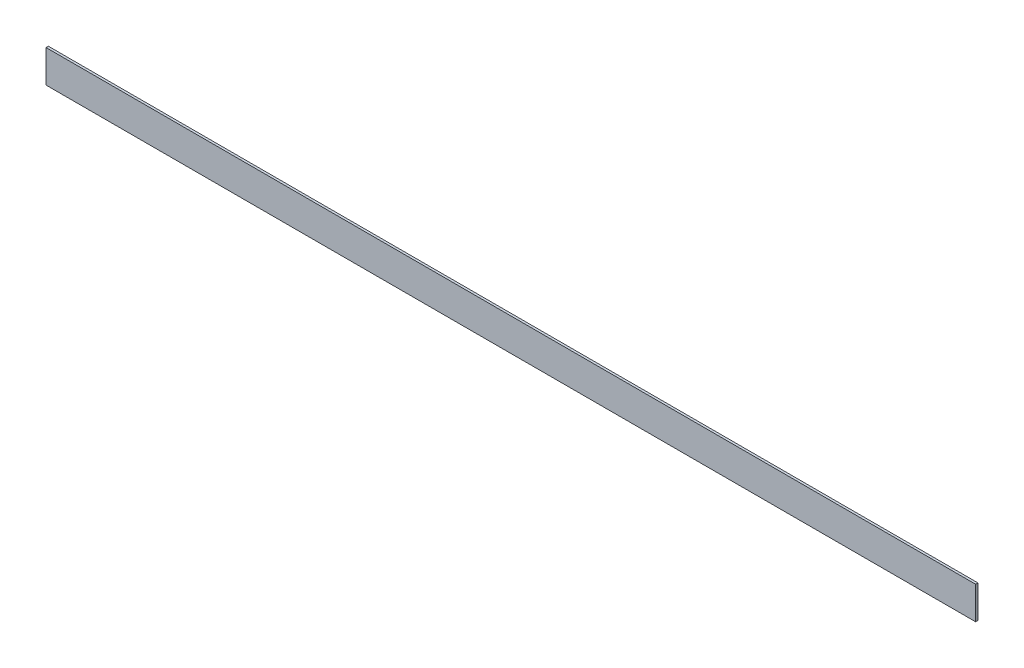
ISO-10303-21;
HEADER;
FILE_DESCRIPTION(('STEP AP214'),'2;1');
FILE_NAME('part.step','',(''),(''),'','','');
FILE_SCHEMA(('AUTOMOTIVE_DESIGN { 1 0 10303 214 1 1 1 1 }'));
ENDSEC;
DATA;
#1=APPLICATION_CONTEXT('core data for automotive mechanical design processes');
#2=APPLICATION_PROTOCOL_DEFINITION('international standard','automotive_design',2000,#1);
#3=PRODUCT_CONTEXT('',#1,'mechanical');
#4=PRODUCT('Part','Part','',(#3));
#5=PRODUCT_RELATED_PRODUCT_CATEGORY('part','',(#4));
#6=PRODUCT_DEFINITION_FORMATION('','',#4);
#7=PRODUCT_DEFINITION_CONTEXT('part definition',#1,'design');
#8=PRODUCT_DEFINITION('design','',#6,#7);
#9=PRODUCT_DEFINITION_SHAPE('','',#8);
#10=(LENGTH_UNIT() NAMED_UNIT(*) SI_UNIT(.MILLI.,.METRE.));
#11=(NAMED_UNIT(*) PLANE_ANGLE_UNIT() SI_UNIT($,.RADIAN.));
#12=(NAMED_UNIT(*) SI_UNIT($,.STERADIAN.) SOLID_ANGLE_UNIT());
#13=UNCERTAINTY_MEASURE_WITH_UNIT(LENGTH_MEASURE(1.E-05),#10,'distance_accuracy_value','');
#14=(GEOMETRIC_REPRESENTATION_CONTEXT(3) GLOBAL_UNCERTAINTY_ASSIGNED_CONTEXT((#13)) GLOBAL_UNIT_ASSIGNED_CONTEXT((#10,
#11,#12)) REPRESENTATION_CONTEXT('',''));
#15=CARTESIAN_POINT('',(0.,0.,0.));
#16=DIRECTION('',(0.,0.,1.));
#17=DIRECTION('',(1.,0.,0.));
#18=AXIS2_PLACEMENT_3D('',#15,#16,#17);
#19=CARTESIAN_POINT('',(-1000.,-35.0000000000001,5.));
#20=DIRECTION('',(1.,0.,0.));
#21=DIRECTION('',(0.,0.,-1.));
#22=AXIS2_PLACEMENT_3D('',#19,#20,#21);
#23=PLANE('',#22);
#24=DIRECTION('',(0.,-1.,0.));
#25=VECTOR('',#24,1.);
#26=CARTESIAN_POINT('',(-1000.,-35.0000000000001,0.));
#27=LINE('',#26,#25);
#28=CARTESIAN_POINT('',(-1000.,34.9999999999999,0.));
#29=VERTEX_POINT('',#28);
#30=CARTESIAN_POINT('',(-1000.,-35.0000000000001,0.));
#31=VERTEX_POINT('',#30);
#32=EDGE_CURVE('E107',#29,#31,#27,.T.);
#33=ORIENTED_EDGE('',*,*,#32,.T.);
#34=DIRECTION('',(0.,0.,-1.));
#35=VECTOR('',#34,1.);
#36=CARTESIAN_POINT('',(-1000.,-35.0000000000001,5.));
#37=LINE('',#36,#35);
#38=CARTESIAN_POINT('',(-1000.,-35.0000000000001,5.));
#39=VERTEX_POINT('',#38);
#40=EDGE_CURVE('E11',#39,#31,#37,.T.);
#41=ORIENTED_EDGE('',*,*,#40,.F.);
#42=DIRECTION('',(0.,-1.,0.));
#43=VECTOR('',#42,1.);
#44=CARTESIAN_POINT('',(-1000.,-35.0000000000001,5.));
#45=LINE('',#44,#43);
#46=CARTESIAN_POINT('',(-1000.,34.9999999999999,5.));
#47=VERTEX_POINT('',#46);
#48=EDGE_CURVE('E91',#47,#39,#45,.T.);
#49=ORIENTED_EDGE('',*,*,#48,.F.);
#50=DIRECTION('',(0.,0.,-1.));
#51=VECTOR('',#50,1.);
#52=CARTESIAN_POINT('',(-1000.,34.9999999999999,5.));
#53=LINE('',#52,#51);
#54=EDGE_CURVE('E103',#47,#29,#53,.T.);
#55=ORIENTED_EDGE('',*,*,#54,.T.);
#56=EDGE_LOOP('',(#33,#41,#49,#55));
#57=FACE_BOUND('',#56,.T.);
#58=ADVANCED_FACE('F39',(#57),#23,.F.);
#59=CARTESIAN_POINT('',(1000.,-34.9999999999999,5.));
#60=DIRECTION('',(0.,1.,0.));
#61=DIRECTION('',(-1.,0.,0.));
#62=AXIS2_PLACEMENT_3D('',#59,#60,#61);
#63=PLANE('',#62);
#64=DIRECTION('',(1.,0.,0.));
#65=VECTOR('',#64,1.);
#66=CARTESIAN_POINT('',(1000.,-34.9999999999999,0.));
#67=LINE('',#66,#65);
#68=CARTESIAN_POINT('',(1000.,-34.9999999999999,0.));
#69=VERTEX_POINT('',#68);
#70=EDGE_CURVE('E96',#31,#69,#67,.T.);
#71=ORIENTED_EDGE('',*,*,#70,.T.);
#72=DIRECTION('',(0.,0.,-1.));
#73=VECTOR('',#72,1.);
#74=CARTESIAN_POINT('',(1000.,-34.9999999999999,5.));
#75=LINE('',#74,#73);
#76=CARTESIAN_POINT('',(1000.,-34.9999999999999,5.));
#77=VERTEX_POINT('',#76);
#78=EDGE_CURVE('E48',#77,#69,#75,.T.);
#79=ORIENTED_EDGE('',*,*,#78,.F.);
#80=DIRECTION('',(1.,0.,0.));
#81=VECTOR('',#80,1.);
#82=CARTESIAN_POINT('',(1000.,-34.9999999999999,5.));
#83=LINE('',#82,#81);
#84=EDGE_CURVE('E86',#39,#77,#83,.T.);
#85=ORIENTED_EDGE('',*,*,#84,.F.);
#86=ORIENTED_EDGE('',*,*,#40,.T.);
#87=EDGE_LOOP('',(#71,#79,#85,#86));
#88=FACE_BOUND('',#87,.T.);
#89=ADVANCED_FACE('F95',(#88),#63,.F.);
#90=CARTESIAN_POINT('',(1000.,-34.9999999999999,5.));
#91=DIRECTION('',(-1.,0.,0.));
#92=DIRECTION('',(0.,0.,1.));
#93=AXIS2_PLACEMENT_3D('',#90,#91,#92);
#94=PLANE('',#93);
#95=DIRECTION('',(0.,1.,0.));
#96=VECTOR('',#95,1.);
#97=CARTESIAN_POINT('',(1000.,-34.9999999999999,0.));
#98=LINE('',#97,#96);
#99=CARTESIAN_POINT('',(1000.,35.0000000000001,0.));
#100=VERTEX_POINT('',#99);
#101=EDGE_CURVE('E73',#69,#100,#98,.T.);
#102=ORIENTED_EDGE('',*,*,#101,.T.);
#103=DIRECTION('',(0.,0.,-1.));
#104=VECTOR('',#103,1.);
#105=CARTESIAN_POINT('',(1000.,35.0000000000001,5.));
#106=LINE('',#105,#104);
#107=CARTESIAN_POINT('',(1000.,35.0000000000001,5.));
#108=VERTEX_POINT('',#107);
#109=EDGE_CURVE('E98',#108,#100,#106,.T.);
#110=ORIENTED_EDGE('',*,*,#109,.F.);
#111=DIRECTION('',(0.,1.,0.));
#112=VECTOR('',#111,1.);
#113=CARTESIAN_POINT('',(1000.,-34.9999999999999,5.));
#114=LINE('',#113,#112);
#115=EDGE_CURVE('E89',#77,#108,#114,.T.);
#116=ORIENTED_EDGE('',*,*,#115,.F.);
#117=ORIENTED_EDGE('',*,*,#78,.T.);
#118=EDGE_LOOP('',(#102,#110,#116,#117));
#119=FACE_BOUND('',#118,.T.);
#120=ADVANCED_FACE('F99',(#119),#94,.F.);
#121=CARTESIAN_POINT('',(1000.,35.0000000000001,5.));
#122=DIRECTION('',(0.,-1.,0.));
#123=DIRECTION('',(1.,0.,0.));
#124=AXIS2_PLACEMENT_3D('',#121,#122,#123);
#125=PLANE('',#124);
#126=DIRECTION('',(-1.,0.,0.));
#127=VECTOR('',#126,1.);
#128=CARTESIAN_POINT('',(1000.,35.0000000000001,0.));
#129=LINE('',#128,#127);
#130=EDGE_CURVE('E79',#100,#29,#129,.T.);
#131=ORIENTED_EDGE('',*,*,#130,.T.);
#132=ORIENTED_EDGE('',*,*,#54,.F.);
#133=DIRECTION('',(-1.,0.,0.));
#134=VECTOR('',#133,1.);
#135=CARTESIAN_POINT('',(1000.,35.0000000000001,5.));
#136=LINE('',#135,#134);
#137=EDGE_CURVE('E56',#108,#47,#136,.T.);
#138=ORIENTED_EDGE('',*,*,#137,.F.);
#139=ORIENTED_EDGE('',*,*,#109,.T.);
#140=EDGE_LOOP('',(#131,#132,#138,#139));
#141=FACE_BOUND('',#140,.T.);
#142=ADVANCED_FACE('F120',(#141),#125,.F.);
#143=CARTESIAN_POINT('',(0.,0.,5.));
#144=DIRECTION('',(0.,0.,1.));
#145=DIRECTION('',(1.,0.,0.));
#146=AXIS2_PLACEMENT_3D('',#143,#144,#145);
#147=PLANE('',#146);
#148=ORIENTED_EDGE('',*,*,#48,.T.);
#149=ORIENTED_EDGE('',*,*,#84,.T.);
#150=ORIENTED_EDGE('',*,*,#115,.T.);
#151=ORIENTED_EDGE('',*,*,#137,.T.);
#152=EDGE_LOOP('',(#148,#149,#150,#151));
#153=FACE_BOUND('',#152,.T.);
#154=ADVANCED_FACE('F87',(#153),#147,.T.);
#155=CARTESIAN_POINT('',(0.,0.,0.));
#156=DIRECTION('',(0.,0.,1.));
#157=DIRECTION('',(1.,0.,0.));
#158=AXIS2_PLACEMENT_3D('',#155,#156,#157);
#159=PLANE('',#158);
#160=ORIENTED_EDGE('',*,*,#32,.F.);
#161=ORIENTED_EDGE('',*,*,#130,.F.);
#162=ORIENTED_EDGE('',*,*,#101,.F.);
#163=ORIENTED_EDGE('',*,*,#70,.F.);
#164=EDGE_LOOP('',(#160,#161,#162,#163));
#165=FACE_BOUND('',#164,.T.);
#166=ADVANCED_FACE('F123',(#165),#159,.F.);
#167=CLOSED_SHELL('',(#58,#89,#120,#142,#154,#166));
#168=MANIFOLD_SOLID_BREP('B2',#167);
#169=ADVANCED_BREP_SHAPE_REPRESENTATION('',(#18,#168),#14);
#170=SHAPE_DEFINITION_REPRESENTATION(#9,#169);
ENDSEC;
END-ISO-10303-21;
